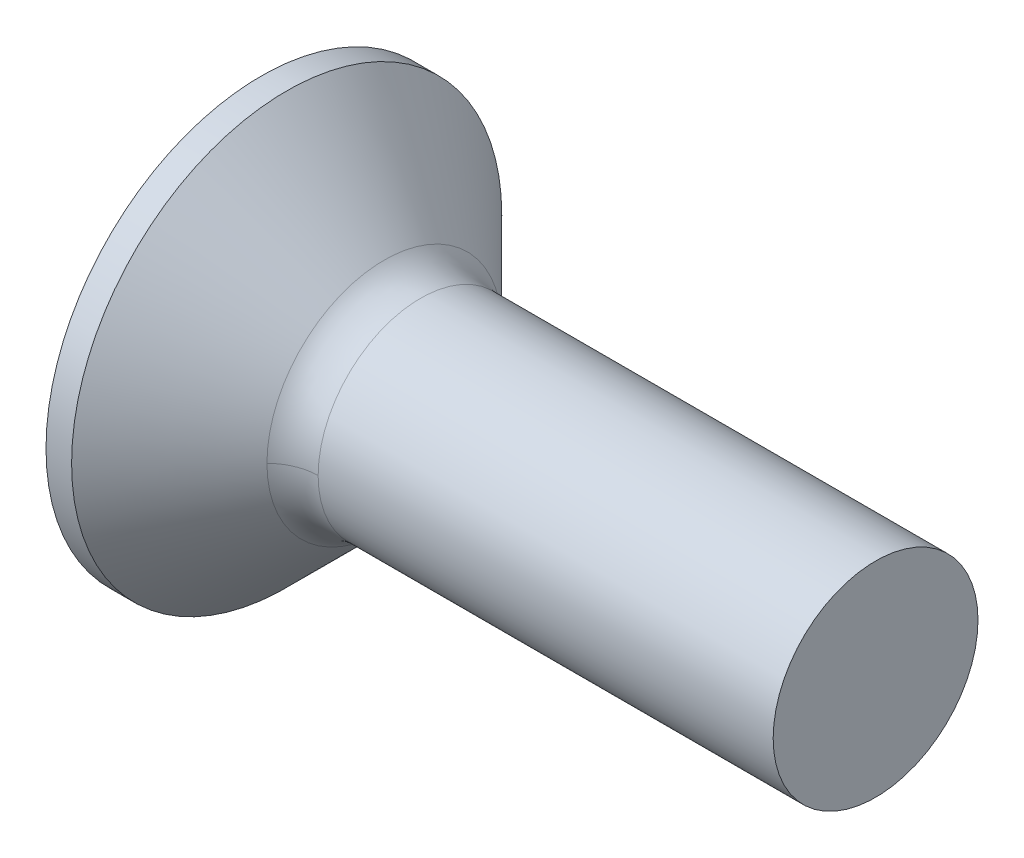
ISO-10303-21;
HEADER;
FILE_DESCRIPTION(('STEP AP214'),'2;1');
FILE_NAME('part.step','',(''),(''),'','','');
FILE_SCHEMA(('AUTOMOTIVE_DESIGN { 1 0 10303 214 1 1 1 1 }'));
ENDSEC;
DATA;
#1=APPLICATION_CONTEXT('core data for automotive mechanical design processes');
#2=APPLICATION_PROTOCOL_DEFINITION('international standard','automotive_design',2000,#1);
#3=PRODUCT_CONTEXT('',#1,'mechanical');
#4=PRODUCT('Part','Part','',(#3));
#5=PRODUCT_RELATED_PRODUCT_CATEGORY('part','',(#4));
#6=PRODUCT_DEFINITION_FORMATION('','',#4);
#7=PRODUCT_DEFINITION_CONTEXT('part definition',#1,'design');
#8=PRODUCT_DEFINITION('design','',#6,#7);
#9=PRODUCT_DEFINITION_SHAPE('','',#8);
#10=(LENGTH_UNIT() NAMED_UNIT(*) SI_UNIT(.MILLI.,.METRE.));
#11=(NAMED_UNIT(*) PLANE_ANGLE_UNIT() SI_UNIT($,.RADIAN.));
#12=(NAMED_UNIT(*) SI_UNIT($,.STERADIAN.) SOLID_ANGLE_UNIT());
#13=UNCERTAINTY_MEASURE_WITH_UNIT(LENGTH_MEASURE(1.E-05),#10,'distance_accuracy_value','');
#14=(GEOMETRIC_REPRESENTATION_CONTEXT(3) GLOBAL_UNCERTAINTY_ASSIGNED_CONTEXT((#13)) GLOBAL_UNIT_ASSIGNED_CONTEXT((#10,
#11,#12)) REPRESENTATION_CONTEXT('',''));
#15=CARTESIAN_POINT('',(0.,0.,0.));
#16=DIRECTION('',(0.,0.,1.));
#17=DIRECTION('',(1.,0.,0.));
#18=AXIS2_PLACEMENT_3D('',#15,#16,#17);
#19=CARTESIAN_POINT('',(2.51,0.,0.));
#20=DIRECTION('',(-1.,0.,0.));
#21=DIRECTION('',(0.,0.,1.));
#22=AXIS2_PLACEMENT_3D('',#19,#20,#21);
#23=CONICAL_SURFACE('',#22,0.851,0.0698131700884116);
#24=CARTESIAN_POINT('',(2.51000000000001,0.,0.));
#25=DIRECTION('',(-1.,0.,0.));
#26=DIRECTION('',(0.,0.,1.));
#27=AXIS2_PLACEMENT_3D('',#24,#25,#26);
#28=CIRCLE('',#27,0.851);
#29=CARTESIAN_POINT('',(2.51000000000001,0.515000000128447,-0.677477674811281));
#30=VERTEX_POINT('',#29);
#31=CARTESIAN_POINT('',(2.50999999998821,0.677477674911375,-0.514999999998138));
#32=VERTEX_POINT('',#31);
#33=EDGE_CURVE('E126',#30,#32,#28,.F.);
#34=ORIENTED_EDGE('',*,*,#33,.T.);
#35=CARTESIAN_POINT('',(-7.25470712172385E-11,0.887981255320598,-0.514999999738052));
#36=CARTESIAN_POINT('',(0.318819879636719,0.862192153268574,-0.51499999990922));
#37=CARTESIAN_POINT('',(0.637620357667007,0.836153848252877,-0.514999999976439));
#38=CARTESIAN_POINT('',(1.27515765628023,0.783330183982056,-0.515000000023561));
#39=CARTESIAN_POINT('',(1.59389447718419,0.756544828595421,-0.515000000003464));
#40=CARTESIAN_POINT('',(2.01216629989946,0.720736675273492,-0.514999999998918));
#41=CARTESIAN_POINT('',(2.11173974714975,0.712163242481372,-0.514999999999459));
#42=CARTESIAN_POINT('',(2.31087725771429,0.694906260205415,-0.515000000000541));
#43=CARTESIAN_POINT('',(2.41044132101322,0.686222710544853,-0.515000000001082));
#44=CARTESIAN_POINT('',(2.50999999997648,0.677477674910992,-0.515));
#45=B_SPLINE_CURVE_WITH_KNOTS('',3,(#35,#36,#37,#38,#39,#40,#41,#42,#43,#44),.UNSPECIFIED.,.F.,
.F.,(4,2,2,2,4),(0.,0.959584754186786,1.91916454022962,2.21899005858181,2.51881605817835),.UNSPECIFIED.);
#46=CARTESIAN_POINT('',(0.,0.887981255466366,-0.515));
#47=VERTEX_POINT('',#46);
#48=EDGE_CURVE('E119',#47,#32,#45,.T.);
#49=ORIENTED_EDGE('',*,*,#48,.F.);
#50=CARTESIAN_POINT('',(0.,0.,0.));
#51=DIRECTION('',(-1.,0.,0.));
#52=DIRECTION('',(0.,0.,1.));
#53=AXIS2_PLACEMENT_3D('',#50,#51,#52);
#54=CIRCLE('',#53,1.026516298);
#55=CARTESIAN_POINT('',(-2.85935113966268E-11,0.515,-0.887981255468678));
#56=VERTEX_POINT('',#55);
#57=EDGE_CURVE('E20',#47,#56,#54,.T.);
#58=ORIENTED_EDGE('',*,*,#57,.T.);
#59=CARTESIAN_POINT('',(2.50999999998217,0.515,-0.677477674910489));
#60=CARTESIAN_POINT('',(2.24584461878122,0.515,-0.700667679814435));
#61=CARTESIAN_POINT('',(1.98165392257068,0.515,-0.723450461944113));
#62=CARTESIAN_POINT('',(1.45321766745748,0.515,-0.768360402906354));
#63=CARTESIAN_POINT('',(1.18897210874822,0.515,-0.79048756401168));
#64=CARTESIAN_POINT('',(0.770601353287124,0.515,-0.825124883970429));
#65=CARTESIAN_POINT('',(0.616489661388993,0.515,-0.837798921148617));
#66=CARTESIAN_POINT('',(0.308253737302725,0.515,-0.862997437699919));
#67=CARTESIAN_POINT('',(0.154129505090094,0.515,-0.875521916773493));
#68=CARTESIAN_POINT('',(-5.6932000135886E-11,0.515,-0.887981255470971));
#69=B_SPLINE_CURVE_WITH_KNOTS('',3,(#59,#60,#61,#62,#63,#64,#65,#66,#67,#68),.UNSPECIFIED.,.F.,
.F.,(4,2,2,2,4),(0.,0.795513110102209,1.59102346217274,2.05491931016661,2.51881608711106),.UNSPECIFIED.);
#70=EDGE_CURVE('E149',#30,#56,#69,.T.);
#71=ORIENTED_EDGE('',*,*,#70,.F.);
#72=EDGE_LOOP('',(#34,#49,#58,#71));
#73=FACE_BOUND('',#72,.T.);
#74=ADVANCED_FACE('F16',(#73),#23,.F.);
#75=CARTESIAN_POINT('',(0.,0.668342541,-0.515));
#76=DIRECTION('',(0.,0.,1.));
#77=DIRECTION('',(1.,0.,0.));
#78=AXIS2_PLACEMENT_3D('',#75,#76,#77);
#79=PLANE('',#78);
#80=DIRECTION('',(0.,1.,0.));
#81=VECTOR('',#80,1.);
#82=CARTESIAN_POINT('',(2.51,1.4387388375,-0.515));
#83=LINE('',#82,#81);
#84=CARTESIAN_POINT('',(2.51,0.948560206845572,-0.515));
#85=VERTEX_POINT('',#84);
#86=EDGE_CURVE('E140',#32,#85,#83,.T.);
#87=ORIENTED_EDGE('',*,*,#86,.T.);
#88=DIRECTION('',(0.894934367754668,-0.446197800769517,0.));
#89=VECTOR('',#88,1.);
#90=CARTESIAN_POINT('',(1.255,1.5742801035,-0.515));
#91=LINE('',#90,#89);
#92=CARTESIAN_POINT('',(0.,2.19999999989061,-0.515));
#93=VERTEX_POINT('',#92);
#94=EDGE_CURVE('E123',#93,#85,#91,.T.);
#95=ORIENTED_EDGE('',*,*,#94,.F.);
#96=DIRECTION('',(0.,-1.,0.));
#97=VECTOR('',#96,1.);
#98=CARTESIAN_POINT('',(0.,1.4387388375,-0.515));
#99=LINE('',#98,#97);
#100=EDGE_CURVE('E114',#93,#47,#99,.T.);
#101=ORIENTED_EDGE('',*,*,#100,.T.);
#102=ORIENTED_EDGE('',*,*,#48,.T.);
#103=EDGE_LOOP('',(#87,#95,#101,#102));
#104=FACE_BOUND('',#103,.T.);
#105=ADVANCED_FACE('F117',(#104),#79,.T.);
#106=CARTESIAN_POINT('',(12.,-2.024,2.024));
#107=DIRECTION('',(1.,0.,0.));
#108=DIRECTION('',(0.,0.,-1.));
#109=AXIS2_PLACEMENT_3D('',#106,#107,#108);
#110=PLANE('',#109);
#111=CARTESIAN_POINT('',(12.,0.,0.));
#112=DIRECTION('',(-1.,0.,0.));
#113=DIRECTION('',(0.,0.,1.));
#114=AXIS2_PLACEMENT_3D('',#111,#112,#113);
#115=CIRCLE('',#114,2.);
#116=CARTESIAN_POINT('',(12.,0.,2.));
#117=VERTEX_POINT('',#116);
#118=EDGE_CURVE('E381',#117,#117,#115,.F.);
#119=ORIENTED_EDGE('',*,*,#118,.T.);
#120=EDGE_LOOP('',(#119));
#121=FACE_BOUND('',#120,.T.);
#122=ADVANCED_FACE('F520',(#121),#110,.T.);
#123=CARTESIAN_POINT('',(0.,0.515,-2.209135134));
#124=DIRECTION('',(0.,-1.,0.));
#125=DIRECTION('',(1.,0.,0.));
#126=AXIS2_PLACEMENT_3D('',#123,#124,#125);
#127=PLANE('',#126);
#128=DIRECTION('',(0.,0.,-1.));
#129=VECTOR('',#128,1.);
#130=CARTESIAN_POINT('',(0.,0.515,-1.4387388375));
#131=LINE('',#130,#129);
#132=CARTESIAN_POINT('',(0.,0.515,-2.19999999989061));
#133=VERTEX_POINT('',#132);
#134=EDGE_CURVE('E135',#56,#133,#131,.T.);
#135=ORIENTED_EDGE('',*,*,#134,.T.);
#136=DIRECTION('',(-0.894934367754668,0.,-0.446197800769517));
#137=VECTOR('',#136,1.);
#138=CARTESIAN_POINT('',(1.255,0.515,-1.5742801035));
#139=LINE('',#138,#137);
#140=CARTESIAN_POINT('',(2.51,0.515,-0.948560206845572));
#141=VERTEX_POINT('',#140);
#142=EDGE_CURVE('E363',#141,#133,#139,.T.);
#143=ORIENTED_EDGE('',*,*,#142,.F.);
#144=DIRECTION('',(0.,0.,1.));
#145=VECTOR('',#144,1.);
#146=CARTESIAN_POINT('',(2.51,0.515,-1.4387388375));
#147=LINE('',#146,#145);
#148=EDGE_CURVE('E141',#141,#30,#147,.T.);
#149=ORIENTED_EDGE('',*,*,#148,.T.);
#150=ORIENTED_EDGE('',*,*,#70,.T.);
#151=EDGE_LOOP('',(#135,#143,#149,#150));
#152=FACE_BOUND('',#151,.T.);
#153=ADVANCED_FACE('F553',(#152),#127,.T.);
#154=CARTESIAN_POINT('',(0.,2.2,-0.515));
#155=DIRECTION('',(-0.446197800769517,-0.894934367754668,0.));
#156=DIRECTION('',(0.894934367754668,-0.446197800769517,0.));
#157=AXIS2_PLACEMENT_3D('',#154,#155,#156);
#158=PLANE('',#157);
#159=ORIENTED_EDGE('',*,*,#94,.T.);
#160=DIRECTION('',(0.,0.,1.));
#161=VECTOR('',#160,1.);
#162=CARTESIAN_POINT('',(2.51,0.948560207,0.));
#163=LINE('',#162,#161);
#164=CARTESIAN_POINT('',(2.51,0.948560206768358,0.515));
#165=VERTEX_POINT('',#164);
#166=EDGE_CURVE('E379',#85,#165,#163,.T.);
#167=ORIENTED_EDGE('',*,*,#166,.T.);
#168=DIRECTION('',(0.894934367735432,-0.446197800808098,0.));
#169=VECTOR('',#168,1.);
#170=CARTESIAN_POINT('',(0.,2.19999999967182,0.515));
#171=LINE('',#170,#169);
#172=CARTESIAN_POINT('',(0.,2.19999999983591,0.515));
#173=VERTEX_POINT('',#172);
#174=EDGE_CURVE('E353',#173,#165,#171,.T.);
#175=ORIENTED_EDGE('',*,*,#174,.F.);
#176=DIRECTION('',(0.,0.,-1.));
#177=VECTOR('',#176,1.);
#178=CARTESIAN_POINT('',(0.,2.2,0.));
#179=LINE('',#178,#177);
#180=EDGE_CURVE('E374',#173,#93,#179,.T.);
#181=ORIENTED_EDGE('',*,*,#180,.T.);
#182=EDGE_LOOP('',(#159,#167,#175,#181));
#183=FACE_BOUND('',#182,.T.);
#184=ADVANCED_FACE('F165',(#183),#158,.T.);
#185=CARTESIAN_POINT('',(12.,0.,0.));
#186=DIRECTION('',(-1.,0.,0.));
#187=DIRECTION('',(0.,0.,1.));
#188=AXIS2_PLACEMENT_3D('',#185,#186,#187);
#189=CYLINDRICAL_SURFACE('',#188,2.);
#190=ORIENTED_EDGE('',*,*,#118,.F.);
#191=EDGE_LOOP('',(#190));
#192=FACE_BOUND('',#191,.T.);
#193=CARTESIAN_POINT('',(3.11421356207373,0.,0.));
#194=DIRECTION('',(1.,0.,0.));
#195=DIRECTION('',(0.,1.,0.));
#196=AXIS2_PLACEMENT_3D('',#193,#194,#195);
#197=CIRCLE('',#196,2.00000000028272);
#198=CARTESIAN_POINT('',(3.11421356205332,-2.05103428515331E-10,-2.00000000021204));
#199=VERTEX_POINT('',#198);
#200=CARTESIAN_POINT('',(3.11421356207076,-8.9793628428733E-11,2.00000000021204));
#201=VERTEX_POINT('',#200);
#202=EDGE_CURVE('E343',#199,#201,#197,.T.);
#203=ORIENTED_EDGE('',*,*,#202,.T.);
#204=CARTESIAN_POINT('',(3.11421356207373,0.,0.));
#205=DIRECTION('',(1.,0.,0.));
#206=DIRECTION('',(0.,1.,0.));
#207=AXIS2_PLACEMENT_3D('',#204,#205,#206);
#208=CIRCLE('',#207,2.00000000028272);
#209=EDGE_CURVE('E332',#201,#199,#208,.T.);
#210=ORIENTED_EDGE('',*,*,#209,.T.);
#211=EDGE_LOOP('',(#203,#210));
#212=FACE_BOUND('',#211,.T.);
#213=ADVANCED_FACE('F160',(#192,#212),#189,.T.);
#214=CARTESIAN_POINT('',(2.51,0.515,-0.948560207));
#215=DIRECTION('',(-0.446197800769517,0.,0.894934367754668));
#216=DIRECTION('',(-0.894934367754668,0.,-0.446197800769517));
#217=AXIS2_PLACEMENT_3D('',#214,#215,#216);
#218=PLANE('',#217);
#219=DIRECTION('',(-0.894934367735432,0.,-0.446197800808098));
#220=VECTOR('',#219,1.);
#221=CARTESIAN_POINT('',(2.51,-0.515,-0.948560206536716));
#222=LINE('',#221,#220);
#223=CARTESIAN_POINT('',(2.51,-0.515,-0.948560206768358));
#224=VERTEX_POINT('',#223);
#225=CARTESIAN_POINT('',(0.,-0.515,-2.19999999983591));
#226=VERTEX_POINT('',#225);
#227=EDGE_CURVE('E318',#224,#226,#222,.T.);
#228=ORIENTED_EDGE('',*,*,#227,.F.);
#229=DIRECTION('',(0.,1.,0.));
#230=VECTOR('',#229,1.);
#231=CARTESIAN_POINT('',(2.51,0.,-0.948560207));
#232=LINE('',#231,#230);
#233=EDGE_CURVE('E356',#224,#141,#232,.T.);
#234=ORIENTED_EDGE('',*,*,#233,.T.);
#235=ORIENTED_EDGE('',*,*,#142,.T.);
#236=DIRECTION('',(0.,-1.,0.));
#237=VECTOR('',#236,1.);
#238=CARTESIAN_POINT('',(0.,0.,-2.2));
#239=LINE('',#238,#237);
#240=EDGE_CURVE('E359',#133,#226,#239,.T.);
#241=ORIENTED_EDGE('',*,*,#240,.T.);
#242=EDGE_LOOP('',(#228,#234,#235,#241));
#243=FACE_BOUND('',#242,.T.);
#244=ADVANCED_FACE('F164',(#243),#218,.T.);
#245=CARTESIAN_POINT('',(0.,0.668342541,0.515));
#246=DIRECTION('',(0.,0.,-1.));
#247=DIRECTION('',(0.,1.,0.));
#248=AXIS2_PLACEMENT_3D('',#245,#246,#247);
#249=PLANE('',#248);
#250=DIRECTION('',(0.,1.,0.));
#251=VECTOR('',#250,1.);
#252=CARTESIAN_POINT('',(0.,1.4387388375,0.515));
#253=LINE('',#252,#251);
#254=CARTESIAN_POINT('',(0.,0.887981255466366,0.515));
#255=VERTEX_POINT('',#254);
#256=EDGE_CURVE('E348',#255,#173,#253,.T.);
#257=ORIENTED_EDGE('',*,*,#256,.T.);
#258=ORIENTED_EDGE('',*,*,#174,.T.);
#259=DIRECTION('',(0.,-1.,0.));
#260=VECTOR('',#259,1.);
#261=CARTESIAN_POINT('',(2.51,1.4387388375,0.515));
#262=LINE('',#261,#260);
#263=CARTESIAN_POINT('',(2.51000000000001,0.677477675015967,0.514999999859184));
#264=VERTEX_POINT('',#263);
#265=EDGE_CURVE('E354',#165,#264,#262,.T.);
#266=ORIENTED_EDGE('',*,*,#265,.T.);
#267=CARTESIAN_POINT('',(-6.23890795979364E-11,0.887981255359255,0.514999999806251));
#268=CARTESIAN_POINT('',(0.318819879644557,0.862192153281618,0.514999999932855));
#269=CARTESIAN_POINT('',(0.637620357673799,0.83615384825587,0.514999999982573));
#270=CARTESIAN_POINT('',(1.27515765628601,0.78333018397802,0.515000000017427));
#271=CARTESIAN_POINT('',(1.59389447719001,0.756544828594407,0.515000000002563));
#272=CARTESIAN_POINT('',(2.01216629990365,0.720736675273295,0.514999999999199));
#273=CARTESIAN_POINT('',(2.11173974715245,0.71216324248122,0.5149999999996));
#274=CARTESIAN_POINT('',(2.31087725771403,0.694906260205355,0.5150000000004));
#275=CARTESIAN_POINT('',(2.41044132101147,0.686222710544842,0.515000000000801));
#276=CARTESIAN_POINT('',(2.50999999997326,0.677477674911275,0.515));
#277=B_SPLINE_CURVE_WITH_KNOTS('',3,(#267,#268,#269,#270,#271,#272,#273,#274,#275,#276),
.UNSPECIFIED.,.F.,.F.,(4,2,2,2,4),(0.,0.959584754186115,1.91916454022833,2.21899005857607,
2.51881605816815),.UNSPECIFIED.);
#278=EDGE_CURVE('E200',#255,#264,#277,.T.);
#279=ORIENTED_EDGE('',*,*,#278,.F.);
#280=EDGE_LOOP('',(#257,#258,#266,#279));
#281=FACE_BOUND('',#280,.T.);
#282=ADVANCED_FACE('F173',(#281),#249,.T.);
#283=CARTESIAN_POINT('',(3.214046979,0.,2.004995835));
#284=CARTESIAN_POINT('',(3.214046979,4.009991669,2.004995835));
#285=CARTESIAN_POINT('',(3.214046979,4.009991669,-2.004995835));
#286=CARTESIAN_POINT('',(3.214046979,0.,-2.004995835));
#287=CARTESIAN_POINT('',(2.873263226,0.,1.970803409));
#288=CARTESIAN_POINT('',(2.873263226,3.941606817,1.970803409));
#289=CARTESIAN_POINT('',(2.873263226,3.941606817,-1.970803409));
#290=CARTESIAN_POINT('',(2.873263226,0.,-1.970803409));
#291=CARTESIAN_POINT('',(2.55683929,0.,2.101870494));
#292=CARTESIAN_POINT('',(2.55683929,4.203740989,2.101870494));
#293=CARTESIAN_POINT('',(2.55683929,4.203740989,-2.101870494));
#294=CARTESIAN_POINT('',(2.55683929,0.,-2.101870494));
#295=CARTESIAN_POINT('',(2.340046484,0.,2.367018693));
#296=CARTESIAN_POINT('',(2.340046484,4.734037387,2.367018693));
#297=CARTESIAN_POINT('',(2.340046484,4.734037387,-2.367018693));
#298=CARTESIAN_POINT('',(2.340046484,0.,-2.367018693));
#299=(BOUNDED_SURFACE() B_SPLINE_SURFACE(3,3,((#283,#284,#285,#286),(#287,#288,#289,#290),(#291,
#292,#293,#294),(#295,#296,#297,#298)),.UNSPECIFIED.,.F.,.F.,
.F.) B_SPLINE_SURFACE_WITH_KNOTS((4,4),(4,4),(0.,1.),(0.,1.),
.UNSPECIFIED.) GEOMETRIC_REPRESENTATION_ITEM() RATIONAL_B_SPLINE_SURFACE(((1.,0.333333333333333,
0.333333333333333,1.),(0.920706259011135,0.306902086337045,0.306902086337045,0.920706259011135),
(0.920706259011135,0.306902086337045,0.306902086337045,0.920706259011135),(1.,0.333333333333333,
0.333333333333333,1.))) REPRESENTATION_ITEM('') SURFACE());
#300=CARTESIAN_POINT('',(2.40710678099998,0.,0.));
#301=DIRECTION('',(-1.,0.,0.));
#302=DIRECTION('',(0.,0.,1.));
#303=AXIS2_PLACEMENT_3D('',#300,#301,#302);
#304=CIRCLE('',#303,2.292893219);
#305=CARTESIAN_POINT('',(2.40710678110323,-7.05420390654683E-10,-2.29289321882874));
#306=VERTEX_POINT('',#305);
#307=CARTESIAN_POINT('',(2.40710678096737,-2.05887201733649E-10,2.2928932189646));
#308=VERTEX_POINT('',#307);
#309=EDGE_CURVE('E304',#306,#308,#304,.F.);
#310=CARTESIAN_POINT('',(3.214046979,0.,2.004995835));
#311=CARTESIAN_POINT('',(2.873263226,0.,1.970803409));
#312=CARTESIAN_POINT('',(2.55683929,0.,2.101870494));
#313=CARTESIAN_POINT('',(2.340046484,0.,2.367018693));
#314=(BOUNDED_CURVE() B_SPLINE_CURVE(3,(#310,#311,#312,#313),.UNSPECIFIED.,.F.,
.F.) B_SPLINE_CURVE_WITH_KNOTS((4,4),(0.,1.),
.UNSPECIFIED.) CURVE() GEOMETRIC_REPRESENTATION_ITEM() RATIONAL_B_SPLINE_CURVE((1.,
0.920706259011135,0.920706259011135,1.)) REPRESENTATION_ITEM(''));
#315=EDGE_CURVE('E337',#308,#201,#314,.F.);
#316=CARTESIAN_POINT('',(3.214046979,0.,-2.004995835));
#317=CARTESIAN_POINT('',(2.873263226,0.,-1.970803409));
#318=CARTESIAN_POINT('',(2.55683929,0.,-2.101870494));
#319=CARTESIAN_POINT('',(2.340046484,0.,-2.367018693));
#320=(BOUNDED_CURVE() B_SPLINE_CURVE(3,(#316,#317,#318,#319),.UNSPECIFIED.,.F.,
.F.) B_SPLINE_CURVE_WITH_KNOTS((4,4),(0.,1.),
.UNSPECIFIED.) CURVE() GEOMETRIC_REPRESENTATION_ITEM() RATIONAL_B_SPLINE_CURVE((1.,
0.920706259011135,0.920706259011135,1.)) REPRESENTATION_ITEM(''));
#321=EDGE_CURVE('E323',#199,#306,#320,.T.);
#322=ORIENTED_EDGE('',*,*,#309,.T.);
#323=ORIENTED_EDGE('',*,*,#315,.T.);
#324=ORIENTED_EDGE('',*,*,#202,.F.);
#325=ORIENTED_EDGE('',*,*,#321,.T.);
#326=EDGE_LOOP('',(#322,#323,#324,#325));
#327=FACE_BOUND('',#326,.T.);
#328=ADVANCED_FACE('F167',(#327),#299,.F.);
#329=CARTESIAN_POINT('',(3.214046979,0.,-2.004995835));
#330=CARTESIAN_POINT('',(3.214046979,-4.009991669,-2.004995835));
#331=CARTESIAN_POINT('',(3.214046979,-4.009991669,2.004995835));
#332=CARTESIAN_POINT('',(3.214046979,0.,2.004995835));
#333=CARTESIAN_POINT('',(2.873263226,0.,-1.970803409));
#334=CARTESIAN_POINT('',(2.873263226,-3.941606817,-1.970803409));
#335=CARTESIAN_POINT('',(2.873263226,-3.941606817,1.970803409));
#336=CARTESIAN_POINT('',(2.873263226,0.,1.970803409));
#337=CARTESIAN_POINT('',(2.55683929,0.,-2.101870494));
#338=CARTESIAN_POINT('',(2.55683929,-4.203740989,-2.101870494));
#339=CARTESIAN_POINT('',(2.55683929,-4.203740989,2.101870494));
#340=CARTESIAN_POINT('',(2.55683929,0.,2.101870494));
#341=CARTESIAN_POINT('',(2.340046484,0.,-2.367018693));
#342=CARTESIAN_POINT('',(2.340046484,-4.734037387,-2.367018693));
#343=CARTESIAN_POINT('',(2.340046484,-4.734037387,2.367018693));
#344=CARTESIAN_POINT('',(2.340046484,0.,2.367018693));
#345=(BOUNDED_SURFACE() B_SPLINE_SURFACE(3,3,((#329,#330,#331,#332),(#333,#334,#335,#336),(#337,
#338,#339,#340),(#341,#342,#343,#344)),.UNSPECIFIED.,.F.,.F.,
.F.) B_SPLINE_SURFACE_WITH_KNOTS((4,4),(4,4),(0.,1.),(0.,1.),
.UNSPECIFIED.) GEOMETRIC_REPRESENTATION_ITEM() RATIONAL_B_SPLINE_SURFACE(((1.,0.333333333333333,
0.333333333333333,1.),(0.920706259011135,0.306902086337045,0.306902086337045,0.920706259011135),
(0.920706259011135,0.306902086337045,0.306902086337045,0.920706259011135),(1.,0.333333333333333,
0.333333333333333,1.))) REPRESENTATION_ITEM('') SURFACE());
#346=CARTESIAN_POINT('',(2.40710678099998,0.,0.));
#347=DIRECTION('',(-1.,0.,0.));
#348=DIRECTION('',(0.,0.,1.));
#349=AXIS2_PLACEMENT_3D('',#346,#347,#348);
#350=CIRCLE('',#349,2.292893219);
#351=EDGE_CURVE('E298',#308,#306,#350,.F.);
#352=ORIENTED_EDGE('',*,*,#321,.F.);
#353=ORIENTED_EDGE('',*,*,#209,.F.);
#354=ORIENTED_EDGE('',*,*,#315,.F.);
#355=ORIENTED_EDGE('',*,*,#351,.T.);
#356=EDGE_LOOP('',(#352,#353,#354,#355));
#357=FACE_BOUND('',#356,.T.);
#358=ADVANCED_FACE('F172',(#357),#345,.F.);
#359=CARTESIAN_POINT('',(0.,-0.515,-2.209135134));
#360=DIRECTION('',(0.,1.,0.));
#361=DIRECTION('',(0.,0.,1.));
#362=AXIS2_PLACEMENT_3D('',#359,#360,#361);
#363=PLANE('',#362);
#364=DIRECTION('',(0.,0.,-1.));
#365=VECTOR('',#364,1.);
#366=CARTESIAN_POINT('',(2.51,-0.515,-1.4387388375));
#367=LINE('',#366,#365);
#368=CARTESIAN_POINT('',(2.51000000000001,-0.515000000067614,-0.677477674857525));
#369=VERTEX_POINT('',#368);
#370=EDGE_CURVE('E319',#369,#224,#367,.T.);
#371=ORIENTED_EDGE('',*,*,#370,.T.);
#372=ORIENTED_EDGE('',*,*,#227,.T.);
#373=DIRECTION('',(0.,0.,1.));
#374=VECTOR('',#373,1.);
#375=CARTESIAN_POINT('',(0.,-0.515,-1.4387388375));
#376=LINE('',#375,#374);
#377=CARTESIAN_POINT('',(-2.98730558439721E-11,-0.515,-0.887981255468781));
#378=VERTEX_POINT('',#377);
#379=EDGE_CURVE('E321',#226,#378,#376,.T.);
#380=ORIENTED_EDGE('',*,*,#379,.T.);
#381=CARTESIAN_POINT('',(2.50999999998707,-0.515,-0.677477674910059));
#382=CARTESIAN_POINT('',(2.24584461878623,-0.515,-0.700667679814001));
#383=CARTESIAN_POINT('',(1.98165392257579,-0.515,-0.723450461943674));
#384=CARTESIAN_POINT('',(1.45321766746281,-0.515,-0.768360402905906));
#385=CARTESIAN_POINT('',(1.18897210875365,-0.515,-0.790487564011227));
#386=CARTESIAN_POINT('',(0.77060135329132,-0.515,-0.825124883970084));
#387=CARTESIAN_POINT('',(0.616489661391847,-0.515,-0.837798921148383));
#388=CARTESIAN_POINT('',(0.308253737302892,-0.515,-0.862997437699906));
#389=CARTESIAN_POINT('',(0.154129505088917,-0.515,-0.875521916773589));
#390=CARTESIAN_POINT('',(-5.94528920877672E-11,-0.515,-0.887981255471175));
#391=B_SPLINE_CURVE_WITH_KNOTS('',3,(#381,#382,#383,#384,#385,#386,#387,#388,#389,#390),
.UNSPECIFIED.,.F.,.F.,(4,2,2,2,4),(0.,0.795513110101889,1.5910234621721,2.05491931017002,
2.5188160871185),.UNSPECIFIED.);
#392=EDGE_CURVE('E290',#369,#378,#391,.T.);
#393=ORIENTED_EDGE('',*,*,#392,.F.);
#394=EDGE_LOOP('',(#371,#372,#380,#393));
#395=FACE_BOUND('',#394,.T.);
#396=ADVANCED_FACE('F184',(#395),#363,.T.);
#397=CARTESIAN_POINT('',(2.51,0.,0.));
#398=DIRECTION('',(-1.,0.,0.));
#399=DIRECTION('',(0.,0.,1.));
#400=AXIS2_PLACEMENT_3D('',#397,#398,#399);
#401=CONICAL_SURFACE('',#400,0.851,0.0698131700884116);
#402=CARTESIAN_POINT('',(0.,0.,0.));
#403=DIRECTION('',(-1.,0.,0.));
#404=DIRECTION('',(0.,0.,1.));
#405=AXIS2_PLACEMENT_3D('',#402,#403,#404);
#406=CIRCLE('',#405,1.026516298);
#407=CARTESIAN_POINT('',(0.,0.515,0.887981255466366));
#408=VERTEX_POINT('',#407);
#409=EDGE_CURVE('E317',#408,#255,#406,.T.);
#410=ORIENTED_EDGE('',*,*,#409,.T.);
#411=ORIENTED_EDGE('',*,*,#278,.T.);
#412=CARTESIAN_POINT('',(2.51000000000001,0.,0.));
#413=DIRECTION('',(-1.,0.,0.));
#414=DIRECTION('',(0.,0.,1.));
#415=AXIS2_PLACEMENT_3D('',#412,#413,#414);
#416=CIRCLE('',#415,0.851);
#417=CARTESIAN_POINT('',(2.50999999998668,0.514999999928661,0.677477674964324));
#418=VERTEX_POINT('',#417);
#419=EDGE_CURVE('E314',#264,#418,#416,.F.);
#420=ORIENTED_EDGE('',*,*,#419,.T.);
#421=CARTESIAN_POINT('',(-6.26901258969882E-11,0.514999999808638,0.887981255360661));
#422=CARTESIAN_POINT('',(0.31881987964419,0.514999999933682,0.862192153282127));
#423=CARTESIAN_POINT('',(0.637620357673408,0.514999999982788,0.836153848256026));
#424=CARTESIAN_POINT('',(1.27515765628561,0.515000000017212,0.783330183977929));
#425=CARTESIAN_POINT('',(1.59389447718963,0.515000000002531,0.756544828594421));
#426=CARTESIAN_POINT('',(2.01216629990336,0.514999999999209,0.720736675273325));
#427=CARTESIAN_POINT('',(2.11173974715225,0.514999999999605,0.712163242481241));
#428=CARTESIAN_POINT('',(2.31087725771398,0.515000000000395,0.694906260205356));
#429=CARTESIAN_POINT('',(2.41044132101151,0.515000000000791,0.686222710544833));
#430=CARTESIAN_POINT('',(2.50999999997338,0.515,0.677477674911264));
#431=B_SPLINE_CURVE_WITH_KNOTS('',3,(#421,#422,#423,#424,#425,#426,#427,#428,#429,#430),
.UNSPECIFIED.,.F.,.F.,(4,2,2,2,4),(0.,0.959584754186134,1.91916454022837,2.21899005857636,
2.51881605816869),.UNSPECIFIED.);
#432=EDGE_CURVE('E208',#408,#418,#431,.T.);
#433=ORIENTED_EDGE('',*,*,#432,.F.);
#434=EDGE_LOOP('',(#410,#411,#420,#433));
#435=FACE_BOUND('',#434,.T.);
#436=ADVANCED_FACE('F186',(#435),#401,.F.);
#437=CARTESIAN_POINT('',(2.407106781,0.,0.));
#438=DIRECTION('',(-1.,0.,0.));
#439=DIRECTION('',(0.,0.,1.));
#440=AXIS2_PLACEMENT_3D('',#437,#438,#439);
#441=CONICAL_SURFACE('',#440,2.292893219,0.785398163397448);
#442=ORIENTED_EDGE('',*,*,#351,.F.);
#443=ORIENTED_EDGE('',*,*,#309,.F.);
#444=EDGE_LOOP('',(#442,#443));
#445=FACE_BOUND('',#444,.T.);
#446=CARTESIAN_POINT('',(0.5,0.,0.));
#447=DIRECTION('',(-1.,0.,0.));
#448=DIRECTION('',(0.,0.,1.));
#449=AXIS2_PLACEMENT_3D('',#446,#447,#448);
#450=CIRCLE('',#449,4.2);
#451=CARTESIAN_POINT('',(0.5,0.,4.2));
#452=VERTEX_POINT('',#451);
#453=EDGE_CURVE('E310',#452,#452,#450,.F.);
#454=ORIENTED_EDGE('',*,*,#453,.T.);
#455=EDGE_LOOP('',(#454));
#456=FACE_BOUND('',#455,.T.);
#457=ADVANCED_FACE('F195',(#445,#456),#441,.T.);
#458=CARTESIAN_POINT('',(2.51,0.,0.));
#459=DIRECTION('',(-1.,0.,0.));
#460=DIRECTION('',(0.,0.,1.));
#461=AXIS2_PLACEMENT_3D('',#458,#459,#460);
#462=CONICAL_SURFACE('',#461,0.851,0.0698131700884116);
#463=CARTESIAN_POINT('',(0.,0.,0.));
#464=DIRECTION('',(-1.,0.,0.));
#465=DIRECTION('',(0.,0.,1.));
#466=AXIS2_PLACEMENT_3D('',#463,#464,#465);
#467=CIRCLE('',#466,1.026516298);
#468=CARTESIAN_POINT('',(0.,-0.887981256473654,-0.514999998263199));
#469=VERTEX_POINT('',#468);
#470=EDGE_CURVE('E224',#378,#469,#467,.T.);
#471=ORIENTED_EDGE('',*,*,#470,.T.);
#472=CARTESIAN_POINT('',(2.5099999999791,-0.677477674910759,-0.515));
#473=CARTESIAN_POINT('',(2.24584461877809,-0.700667679814707,-0.515));
#474=CARTESIAN_POINT('',(1.98165392256748,-0.723450461944388,-0.515));
#475=CARTESIAN_POINT('',(1.45321766745415,-0.768360402906635,-0.515));
#476=CARTESIAN_POINT('',(1.18897210874481,-0.790487564011964,-0.515));
#477=CARTESIAN_POINT('',(0.770601353275102,-0.825124883971423,-0.515));
#478=CARTESIAN_POINT('',(0.616489661368421,-0.837798921150308,-0.515));
#479=CARTESIAN_POINT('',(0.308253737265049,-0.862997437702989,-0.515));
#480=CARTESIAN_POINT('',(0.154129505043866,-0.875521916777246,-0.515));
#481=CARTESIAN_POINT('',(-1.11713501698456E-10,-0.887981255475399,-0.515));
#482=B_SPLINE_CURVE_WITH_KNOTS('',3,(#472,#473,#474,#475,#476,#477,#478,#479,#480,#481),
.UNSPECIFIED.,.F.,.F.,(4,2,2,2,4),(0.,0.79551311010241,1.59102346217314,2.05491931019275,
2.51881608716294),.UNSPECIFIED.);
#483=CARTESIAN_POINT('',(2.51000000000001,-0.677477674864095,-0.51500000005897));
#484=VERTEX_POINT('',#483);
#485=EDGE_CURVE('E218',#484,#469,#482,.T.);
#486=ORIENTED_EDGE('',*,*,#485,.F.);
#487=CARTESIAN_POINT('',(2.51000000000001,0.,0.));
#488=DIRECTION('',(-1.,0.,0.));
#489=DIRECTION('',(0.,0.,1.));
#490=AXIS2_PLACEMENT_3D('',#487,#488,#489);
#491=CIRCLE('',#490,0.851);
#492=EDGE_CURVE('E295',#484,#369,#491,.F.);
#493=ORIENTED_EDGE('',*,*,#492,.T.);
#494=ORIENTED_EDGE('',*,*,#392,.T.);
#495=EDGE_LOOP('',(#471,#486,#493,#494));
#496=FACE_BOUND('',#495,.T.);
#497=ADVANCED_FACE('F230',(#496),#462,.F.);
#498=CARTESIAN_POINT('',(0.,0.515,0.668342541));
#499=DIRECTION('',(0.,-1.,0.));
#500=DIRECTION('',(1.,0.,0.));
#501=AXIS2_PLACEMENT_3D('',#498,#499,#500);
#502=PLANE('',#501);
#503=DIRECTION('',(0.,0.,1.));
#504=VECTOR('',#503,1.);
#505=CARTESIAN_POINT('',(2.51,0.515,1.4387388375));
#506=LINE('',#505,#504);
#507=CARTESIAN_POINT('',(2.51,0.515,0.948560206845572));
#508=VERTEX_POINT('',#507);
#509=EDGE_CURVE('E216',#418,#508,#506,.T.);
#510=ORIENTED_EDGE('',*,*,#509,.T.);
#511=DIRECTION('',(0.894934367754668,0.,-0.446197800769517));
#512=VECTOR('',#511,1.);
#513=CARTESIAN_POINT('',(1.255,0.515,1.5742801035));
#514=LINE('',#513,#512);
#515=CARTESIAN_POINT('',(-1.78042765715721E-10,0.514999998842133,2.20000000042524));
#516=VERTEX_POINT('',#515);
#517=EDGE_CURVE('E455',#516,#508,#514,.T.);
#518=ORIENTED_EDGE('',*,*,#517,.F.);
#519=DIRECTION('',(0.,0.,-1.));
#520=VECTOR('',#519,1.);
#521=CARTESIAN_POINT('',(0.,0.515,1.4387388375));
#522=LINE('',#521,#520);
#523=EDGE_CURVE('E217',#516,#408,#522,.T.);
#524=ORIENTED_EDGE('',*,*,#523,.T.);
#525=ORIENTED_EDGE('',*,*,#432,.T.);
#526=EDGE_LOOP('',(#510,#518,#524,#525));
#527=FACE_BOUND('',#526,.T.);
#528=ADVANCED_FACE('F225',(#527),#502,.T.);
#529=CARTESIAN_POINT('',(0.5,0.,0.));
#530=DIRECTION('',(-1.,0.,0.));
#531=DIRECTION('',(0.,0.,1.));
#532=AXIS2_PLACEMENT_3D('',#529,#530,#531);
#533=CYLINDRICAL_SURFACE('',#532,4.2);
#534=ORIENTED_EDGE('',*,*,#453,.F.);
#535=EDGE_LOOP('',(#534));
#536=FACE_BOUND('',#535,.T.);
#537=CARTESIAN_POINT('',(0.,0.,0.));
#538=DIRECTION('',(-1.,0.,0.));
#539=DIRECTION('',(0.,0.,1.));
#540=AXIS2_PLACEMENT_3D('',#537,#538,#539);
#541=CIRCLE('',#540,4.2);
#542=CARTESIAN_POINT('',(0.,0.,4.2));
#543=VERTEX_POINT('',#542);
#544=EDGE_CURVE('E454',#543,#543,#541,.T.);
#545=ORIENTED_EDGE('',*,*,#544,.F.);
#546=EDGE_LOOP('',(#545));
#547=FACE_BOUND('',#546,.T.);
#548=ADVANCED_FACE('F229',(#536,#547),#533,.T.);
#549=CARTESIAN_POINT('',(0.,-2.209135134,-0.515));
#550=DIRECTION('',(0.,0.,1.));
#551=DIRECTION('',(1.,0.,0.));
#552=AXIS2_PLACEMENT_3D('',#549,#550,#551);
#553=PLANE('',#552);
#554=DIRECTION('',(0.,1.,0.));
#555=VECTOR('',#554,1.);
#556=CARTESIAN_POINT('',(0.,0.,-0.514999996526399));
#557=LINE('',#556,#555);
#558=CARTESIAN_POINT('',(0.,-2.20000000044587,-0.514999998842133));
#559=VERTEX_POINT('',#558);
#560=EDGE_CURVE('E443',#559,#469,#557,.T.);
#561=ORIENTED_EDGE('',*,*,#560,.F.);
#562=DIRECTION('',(-0.894934367754668,-0.446197800769517,0.));
#563=VECTOR('',#562,1.);
#564=CARTESIAN_POINT('',(1.255,-1.5742801035,-0.515));
#565=LINE('',#564,#563);
#566=CARTESIAN_POINT('',(2.51,-0.948560206845572,-0.515));
#567=VERTEX_POINT('',#566);
#568=EDGE_CURVE('E440',#567,#559,#565,.T.);
#569=ORIENTED_EDGE('',*,*,#568,.F.);
#570=DIRECTION('',(0.,1.,0.));
#571=VECTOR('',#570,1.);
#572=CARTESIAN_POINT('',(2.51,-1.4387388375,-0.515));
#573=LINE('',#572,#571);
#574=EDGE_CURVE('E313',#567,#484,#573,.T.);
#575=ORIENTED_EDGE('',*,*,#574,.T.);
#576=ORIENTED_EDGE('',*,*,#485,.T.);
#577=EDGE_LOOP('',(#561,#569,#575,#576));
#578=FACE_BOUND('',#577,.T.);
#579=ADVANCED_FACE('F233',(#578),#553,.T.);
#580=CARTESIAN_POINT('',(0.,0.515,2.2));
#581=DIRECTION('',(-0.446197800769517,0.,-0.894934367754668));
#582=DIRECTION('',(0.894934367754668,0.,-0.446197800769517));
#583=AXIS2_PLACEMENT_3D('',#580,#581,#582);
#584=PLANE('',#583);
#585=ORIENTED_EDGE('',*,*,#517,.T.);
#586=DIRECTION('',(0.,-1.,0.));
#587=VECTOR('',#586,1.);
#588=CARTESIAN_POINT('',(2.51,0.,0.948560207));
#589=LINE('',#588,#587);
#590=CARTESIAN_POINT('',(2.51,-0.515,0.948560206768358));
#591=VERTEX_POINT('',#590);
#592=EDGE_CURVE('E452',#508,#591,#589,.T.);
#593=ORIENTED_EDGE('',*,*,#592,.T.);
#594=DIRECTION('',(0.894934367735432,0.,-0.446197800808098));
#595=VECTOR('',#594,1.);
#596=CARTESIAN_POINT('',(0.,-0.515,2.19999999967182));
#597=LINE('',#596,#595);
#598=CARTESIAN_POINT('',(0.,-0.515,2.20000000050471));
#599=VERTEX_POINT('',#598);
#600=EDGE_CURVE('E423',#599,#591,#597,.T.);
#601=ORIENTED_EDGE('',*,*,#600,.F.);
#602=DIRECTION('',(0.,-1.,0.));
#603=VECTOR('',#602,1.);
#604=CARTESIAN_POINT('',(0.,0.,2.2000000013376));
#605=LINE('',#604,#603);
#606=EDGE_CURVE('E446',#516,#599,#605,.T.);
#607=ORIENTED_EDGE('',*,*,#606,.F.);
#608=EDGE_LOOP('',(#585,#593,#601,#607));
#609=FACE_BOUND('',#608,.T.);
#610=ADVANCED_FACE('F237',(#609),#584,.T.);
#611=CARTESIAN_POINT('',(0.,-4.2504,-4.2504));
#612=DIRECTION('',(-1.,0.,0.));
#613=DIRECTION('',(0.,0.,1.));
#614=AXIS2_PLACEMENT_3D('',#611,#612,#613);
#615=PLANE('',#614);
#616=ORIENTED_EDGE('',*,*,#523,.F.);
#617=ORIENTED_EDGE('',*,*,#606,.T.);
#618=DIRECTION('',(0.,0.,1.));
#619=VECTOR('',#618,1.);
#620=CARTESIAN_POINT('',(0.,-0.515,1.4387388375));
#621=LINE('',#620,#619);
#622=CARTESIAN_POINT('',(0.,-0.515,0.887981255466366));
#623=VERTEX_POINT('',#622);
#624=EDGE_CURVE('E425',#623,#599,#621,.T.);
#625=ORIENTED_EDGE('',*,*,#624,.F.);
#626=CARTESIAN_POINT('',(0.,0.,0.));
#627=DIRECTION('',(-1.,0.,0.));
#628=DIRECTION('',(0.,0.,1.));
#629=AXIS2_PLACEMENT_3D('',#626,#627,#628);
#630=CIRCLE('',#629,1.026516298);
#631=CARTESIAN_POINT('',(0.,-0.887981255466366,0.515));
#632=VERTEX_POINT('',#631);
#633=EDGE_CURVE('E411',#623,#632,#630,.F.);
#634=ORIENTED_EDGE('',*,*,#633,.T.);
#635=DIRECTION('',(0.,1.,0.));
#636=VECTOR('',#635,1.);
#637=CARTESIAN_POINT('',(0.,-1.4387388375,0.515));
#638=LINE('',#637,#636);
#639=CARTESIAN_POINT('',(0.,-2.19999999983591,0.515));
#640=VERTEX_POINT('',#639);
#641=EDGE_CURVE('E419',#640,#632,#638,.T.);
#642=ORIENTED_EDGE('',*,*,#641,.F.);
#643=DIRECTION('',(0.,0.,1.));
#644=VECTOR('',#643,1.);
#645=CARTESIAN_POINT('',(0.,-2.2,0.));
#646=LINE('',#645,#644);
#647=EDGE_CURVE('E436',#559,#640,#646,.T.);
#648=ORIENTED_EDGE('',*,*,#647,.F.);
#649=ORIENTED_EDGE('',*,*,#560,.T.);
#650=ORIENTED_EDGE('',*,*,#470,.F.);
#651=ORIENTED_EDGE('',*,*,#379,.F.);
#652=ORIENTED_EDGE('',*,*,#240,.F.);
#653=ORIENTED_EDGE('',*,*,#134,.F.);
#654=ORIENTED_EDGE('',*,*,#57,.F.);
#655=ORIENTED_EDGE('',*,*,#100,.F.);
#656=ORIENTED_EDGE('',*,*,#180,.F.);
#657=ORIENTED_EDGE('',*,*,#256,.F.);
#658=ORIENTED_EDGE('',*,*,#409,.F.);
#659=EDGE_LOOP('',(#616,#617,#625,#634,#642,#648,#649,#650,#651,#652,#653,#654,#655,#656,#657,#658));
#660=FACE_BOUND('',#659,.T.);
#661=ORIENTED_EDGE('',*,*,#544,.T.);
#662=EDGE_LOOP('',(#661));
#663=FACE_BOUND('',#662,.T.);
#664=ADVANCED_FACE('F131',(#660,#663),#615,.T.);
#665=CARTESIAN_POINT('',(2.51,-0.948560207,-0.515));
#666=DIRECTION('',(-0.446197800769517,0.894934367754668,0.));
#667=DIRECTION('',(-0.894934367754668,-0.446197800769517,0.));
#668=AXIS2_PLACEMENT_3D('',#665,#666,#667);
#669=PLANE('',#668);
#670=DIRECTION('',(-0.894934367735432,-0.446197800808098,0.));
#671=VECTOR('',#670,1.);
#672=CARTESIAN_POINT('',(2.51,-0.948560206536716,0.515));
#673=LINE('',#672,#671);
#674=CARTESIAN_POINT('',(2.51,-0.948560206768358,0.515));
#675=VERTEX_POINT('',#674);
#676=EDGE_CURVE('E421',#675,#640,#673,.T.);
#677=ORIENTED_EDGE('',*,*,#676,.F.);
#678=DIRECTION('',(0.,0.,-1.));
#679=VECTOR('',#678,1.);
#680=CARTESIAN_POINT('',(2.51,-0.948560207,0.));
#681=LINE('',#680,#679);
#682=EDGE_CURVE('E433',#675,#567,#681,.T.);
#683=ORIENTED_EDGE('',*,*,#682,.T.);
#684=ORIENTED_EDGE('',*,*,#568,.T.);
#685=ORIENTED_EDGE('',*,*,#647,.T.);
#686=EDGE_LOOP('',(#677,#683,#684,#685));
#687=FACE_BOUND('',#686,.T.);
#688=ADVANCED_FACE('F244',(#687),#669,.T.);
#689=CARTESIAN_POINT('',(2.51,0.67585118,-0.515));
#690=DIRECTION('',(-1.,0.,0.));
#691=DIRECTION('',(0.,0.,1.));
#692=AXIS2_PLACEMENT_3D('',#689,#690,#691);
#693=PLANE('',#692);
#694=ORIENTED_EDGE('',*,*,#265,.F.);
#695=ORIENTED_EDGE('',*,*,#166,.F.);
#696=ORIENTED_EDGE('',*,*,#86,.F.);
#697=CARTESIAN_POINT('',(2.51,0.,0.));
#698=DIRECTION('',(-1.,0.,0.));
#699=DIRECTION('',(0.,0.,1.));
#700=AXIS2_PLACEMENT_3D('',#697,#698,#699);
#701=CIRCLE('',#700,0.851);
#702=EDGE_CURVE('E273',#264,#32,#701,.T.);
#703=ORIENTED_EDGE('',*,*,#702,.F.);
#704=EDGE_LOOP('',(#694,#695,#696,#703));
#705=FACE_BOUND('',#704,.T.);
#706=ADVANCED_FACE('F247',(#705),#693,.T.);
#707=CARTESIAN_POINT('',(0.,-0.515,0.668342541));
#708=DIRECTION('',(0.,1.,0.));
#709=DIRECTION('',(0.,0.,1.));
#710=AXIS2_PLACEMENT_3D('',#707,#708,#709);
#711=PLANE('',#710);
#712=ORIENTED_EDGE('',*,*,#624,.T.);
#713=ORIENTED_EDGE('',*,*,#600,.T.);
#714=DIRECTION('',(0.,0.,-1.));
#715=VECTOR('',#714,1.);
#716=CARTESIAN_POINT('',(2.51,-0.515,1.4387388375));
#717=LINE('',#716,#715);
#718=CARTESIAN_POINT('',(2.50999999999095,-0.514999999989494,0.677477674917705));
#719=VERTEX_POINT('',#718);
#720=EDGE_CURVE('E35',#591,#719,#717,.T.);
#721=ORIENTED_EDGE('',*,*,#720,.T.);
#722=CARTESIAN_POINT('',(-7.7649088548156E-11,-0.514999999696975,0.887981255297232));
#723=CARTESIAN_POINT('',(0.318819879632992,-0.514999999894984,0.862192153260636));
#724=CARTESIAN_POINT('',(0.637620357663888,-0.514999999972744,0.836153848250993));
#725=CARTESIAN_POINT('',(1.27515765627767,-0.515000000027256,0.783330183984409));
#726=CARTESIAN_POINT('',(1.59389447718159,-0.515000000004008,0.756544828595956));
#727=CARTESIAN_POINT('',(2.01216629989826,-0.514999999998748,0.720736675273497));
#728=CARTESIAN_POINT('',(2.11173974714989,-0.514999999999374,0.712163242481311));
#729=CARTESIAN_POINT('',(2.31087725771711,-0.515000000000626,0.694906260205219));
#730=CARTESIAN_POINT('',(2.41044132101739,-0.515000000001252,0.686222710544588));
#731=CARTESIAN_POINT('',(2.50999999998197,-0.515,0.67747767491051));
#732=B_SPLINE_CURVE_WITH_KNOTS('',3,(#722,#723,#724,#725,#726,#727,#728,#729,#730,#731),
.UNSPECIFIED.,.F.,.F.,(4,2,2,2,4),(0.,0.959584754187123,1.91916454023027,2.21899005858648,
2.51881605818705),.UNSPECIFIED.);
#733=EDGE_CURVE('E260',#623,#719,#732,.T.);
#734=ORIENTED_EDGE('',*,*,#733,.F.);
#735=EDGE_LOOP('',(#712,#713,#721,#734));
#736=FACE_BOUND('',#735,.T.);
#737=ADVANCED_FACE('F251',(#736),#711,.T.);
#738=CARTESIAN_POINT('',(0.,-2.209135134,0.515));
#739=DIRECTION('',(0.,0.,-1.));
#740=DIRECTION('',(0.,1.,0.));
#741=AXIS2_PLACEMENT_3D('',#738,#739,#740);
#742=PLANE('',#741);
#743=DIRECTION('',(0.,1.,0.));
#744=VECTOR('',#743,1.);
#745=CARTESIAN_POINT('',(2.51,-0.8122056935,0.515));
#746=LINE('',#745,#744);
#747=CARTESIAN_POINT('',(2.50999999999626,-0.677477674805039,0.51500000013709));
#748=VERTEX_POINT('',#747);
#749=EDGE_CURVE('E268',#675,#748,#746,.T.);
#750=ORIENTED_EDGE('',*,*,#749,.F.);
#751=ORIENTED_EDGE('',*,*,#676,.T.);
#752=ORIENTED_EDGE('',*,*,#641,.T.);
#753=CARTESIAN_POINT('',(2.50999999999252,-0.67747767490958,0.515));
#754=CARTESIAN_POINT('',(2.2458446187918,-0.700667679813517,0.515));
#755=CARTESIAN_POINT('',(1.98165392258148,-0.723450461943186,0.515));
#756=CARTESIAN_POINT('',(1.45321766746874,-0.768360402905407,0.515));
#757=CARTESIAN_POINT('',(1.1889721087597,-0.790487564010722,0.515));
#758=CARTESIAN_POINT('',(0.770601353297018,-0.825124883969614,0.515));
#759=CARTESIAN_POINT('',(0.616489661397075,-0.837798921147954,0.515));
#760=CARTESIAN_POINT('',(0.308253737307182,-0.862997437699557,0.515));
#761=CARTESIAN_POINT('',(0.154129505092738,-0.875521916773279,0.515));
#762=CARTESIAN_POINT('',(-5.61004891926854E-11,-0.887981255470903,0.515));
#763=B_SPLINE_CURVE_WITH_KNOTS('',3,(#753,#754,#755,#756,#757,#758,#759,#760,#761,#762),
.UNSPECIFIED.,.F.,.F.,(4,2,2,2,4),(0.,0.795513110101533,1.59102346217139,2.05491931017072,
2.51881608712061),.UNSPECIFIED.);
#764=EDGE_CURVE('E267',#748,#632,#763,.T.);
#765=ORIENTED_EDGE('',*,*,#764,.F.);
#766=EDGE_LOOP('',(#750,#751,#752,#765));
#767=FACE_BOUND('',#766,.T.);
#768=ADVANCED_FACE('F256',(#767),#742,.T.);
#769=CARTESIAN_POINT('',(2.51,-0.515,-0.948560207));
#770=DIRECTION('',(-1.,0.,0.));
#771=DIRECTION('',(0.,0.,1.));
#772=AXIS2_PLACEMENT_3D('',#769,#770,#771);
#773=PLANE('',#772);
#774=ORIENTED_EDGE('',*,*,#148,.F.);
#775=ORIENTED_EDGE('',*,*,#233,.F.);
#776=ORIENTED_EDGE('',*,*,#370,.F.);
#777=CARTESIAN_POINT('',(2.51000000000001,0.,0.));
#778=DIRECTION('',(-1.,0.,0.));
#779=DIRECTION('',(0.,0.,1.));
#780=AXIS2_PLACEMENT_3D('',#777,#778,#779);
#781=CIRCLE('',#780,0.850999999999961);
#782=EDGE_CURVE('E405',#30,#369,#781,.T.);
#783=ORIENTED_EDGE('',*,*,#782,.F.);
#784=EDGE_LOOP('',(#774,#775,#776,#783));
#785=FACE_BOUND('',#784,.T.);
#786=ADVANCED_FACE('F555',(#785),#773,.T.);
#787=CARTESIAN_POINT('',(2.51,-0.948560207,-0.515));
#788=DIRECTION('',(-1.,0.,0.));
#789=DIRECTION('',(0.,0.,1.));
#790=AXIS2_PLACEMENT_3D('',#787,#788,#789);
#791=PLANE('',#790);
#792=ORIENTED_EDGE('',*,*,#574,.F.);
#793=ORIENTED_EDGE('',*,*,#682,.F.);
#794=ORIENTED_EDGE('',*,*,#749,.T.);
#795=CARTESIAN_POINT('',(2.51,0.,0.));
#796=DIRECTION('',(-1.,0.,0.));
#797=DIRECTION('',(0.,0.,1.));
#798=AXIS2_PLACEMENT_3D('',#795,#796,#797);
#799=CIRCLE('',#798,0.851);
#800=EDGE_CURVE('E403',#484,#748,#799,.T.);
#801=ORIENTED_EDGE('',*,*,#800,.F.);
#802=EDGE_LOOP('',(#792,#793,#794,#801));
#803=FACE_BOUND('',#802,.T.);
#804=ADVANCED_FACE('F280',(#803),#791,.T.);
#805=CARTESIAN_POINT('',(2.51,0.,0.));
#806=DIRECTION('',(-1.,0.,0.));
#807=DIRECTION('',(0.,0.,1.));
#808=AXIS2_PLACEMENT_3D('',#805,#806,#807);
#809=CONICAL_SURFACE('',#808,0.851,0.0698131700884116);
#810=CARTESIAN_POINT('',(2.51000000000001,0.,0.));
#811=DIRECTION('',(-1.,0.,0.));
#812=DIRECTION('',(0.,0.,1.));
#813=AXIS2_PLACEMENT_3D('',#810,#811,#812);
#814=CIRCLE('',#813,0.851);
#815=EDGE_CURVE('E26',#748,#719,#814,.T.);
#816=ORIENTED_EDGE('',*,*,#815,.F.);
#817=ORIENTED_EDGE('',*,*,#764,.T.);
#818=ORIENTED_EDGE('',*,*,#633,.F.);
#819=ORIENTED_EDGE('',*,*,#733,.T.);
#820=EDGE_LOOP('',(#816,#817,#818,#819));
#821=FACE_BOUND('',#820,.T.);
#822=ADVANCED_FACE('F275',(#821),#809,.F.);
#823=CARTESIAN_POINT('',(2.51,-0.515,0.67585118));
#824=DIRECTION('',(-1.,0.,0.));
#825=DIRECTION('',(0.,0.,1.));
#826=AXIS2_PLACEMENT_3D('',#823,#824,#825);
#827=PLANE('',#826);
#828=ORIENTED_EDGE('',*,*,#720,.F.);
#829=ORIENTED_EDGE('',*,*,#592,.F.);
#830=ORIENTED_EDGE('',*,*,#509,.F.);
#831=CARTESIAN_POINT('',(2.51,0.,0.));
#832=DIRECTION('',(-1.,0.,0.));
#833=DIRECTION('',(0.,0.,1.));
#834=AXIS2_PLACEMENT_3D('',#831,#832,#833);
#835=CIRCLE('',#834,0.851);
#836=EDGE_CURVE('E11',#719,#418,#835,.T.);
#837=ORIENTED_EDGE('',*,*,#836,.F.);
#838=EDGE_LOOP('',(#828,#829,#830,#837));
#839=FACE_BOUND('',#838,.T.);
#840=ADVANCED_FACE('F18',(#839),#827,.T.);
#841=CARTESIAN_POINT('',(2.786506661,0.,0.));
#842=DIRECTION('',(-1.,0.,0.));
#843=DIRECTION('',(0.,0.,1.));
#844=AXIS2_PLACEMENT_3D('',#841,#842,#843);
#845=CONICAL_SURFACE('',#844,0.,1.25663706196119);
#846=CARTESIAN_POINT('',(2.786506661,0.,0.));
#847=VERTEX_POINT('',#846);
#848=VERTEX_LOOP('',#847);
#849=FACE_BOUND('',#848,.T.);
#850=ORIENTED_EDGE('',*,*,#815,.T.);
#851=ORIENTED_EDGE('',*,*,#836,.T.);
#852=ORIENTED_EDGE('',*,*,#419,.F.);
#853=ORIENTED_EDGE('',*,*,#702,.T.);
#854=ORIENTED_EDGE('',*,*,#33,.F.);
#855=ORIENTED_EDGE('',*,*,#782,.T.);
#856=ORIENTED_EDGE('',*,*,#492,.F.);
#857=ORIENTED_EDGE('',*,*,#800,.T.);
#858=EDGE_LOOP('',(#850,#851,#852,#853,#854,#855,#856,#857));
#859=FACE_BOUND('',#858,.T.);
#860=ADVANCED_FACE('F282',(#849,#859),#845,.F.);
#861=CLOSED_SHELL('',(#74,#105,#122,#153,#184,#213,#244,#282,#328,#358,#396,#436,#457,#497,#528,
#548,#579,#610,#664,#688,#706,#737,#768,#786,#804,#822,#840,#860));
#862=MANIFOLD_SOLID_BREP('B1',#861);
#863=ADVANCED_BREP_SHAPE_REPRESENTATION('',(#18,#862),#14);
#864=SHAPE_DEFINITION_REPRESENTATION(#9,#863);
ENDSEC;
END-ISO-10303-21;
